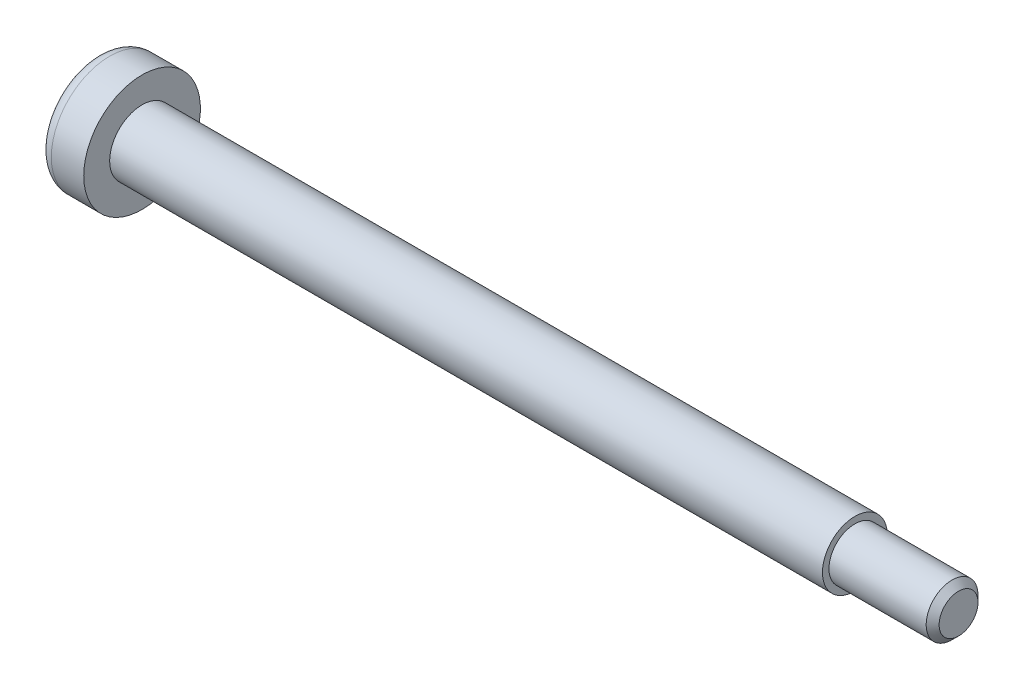
ISO-10303-21;
HEADER;
FILE_DESCRIPTION(('STEP AP214'),'2;1');
FILE_NAME('part.step','',(''),(''),'','','');
FILE_SCHEMA(('AUTOMOTIVE_DESIGN { 1 0 10303 214 1 1 1 1 }'));
ENDSEC;
DATA;
#1=APPLICATION_CONTEXT('core data for automotive mechanical design processes');
#2=APPLICATION_PROTOCOL_DEFINITION('international standard','automotive_design',2000,#1);
#3=PRODUCT_CONTEXT('',#1,'mechanical');
#4=PRODUCT('Part','Part','',(#3));
#5=PRODUCT_RELATED_PRODUCT_CATEGORY('part','',(#4));
#6=PRODUCT_DEFINITION_FORMATION('','',#4);
#7=PRODUCT_DEFINITION_CONTEXT('part definition',#1,'design');
#8=PRODUCT_DEFINITION('design','',#6,#7);
#9=PRODUCT_DEFINITION_SHAPE('','',#8);
#10=(LENGTH_UNIT() NAMED_UNIT(*) SI_UNIT(.MILLI.,.METRE.));
#11=(NAMED_UNIT(*) PLANE_ANGLE_UNIT() SI_UNIT($,.RADIAN.));
#12=(NAMED_UNIT(*) SI_UNIT($,.STERADIAN.) SOLID_ANGLE_UNIT());
#13=UNCERTAINTY_MEASURE_WITH_UNIT(LENGTH_MEASURE(1.E-05),#10,'distance_accuracy_value','');
#14=(GEOMETRIC_REPRESENTATION_CONTEXT(3) GLOBAL_UNCERTAINTY_ASSIGNED_CONTEXT((#13)) GLOBAL_UNIT_ASSIGNED_CONTEXT((#10,
#11,#12)) REPRESENTATION_CONTEXT('',''));
#15=CARTESIAN_POINT('',(0.,0.,0.));
#16=DIRECTION('',(0.,0.,1.));
#17=DIRECTION('',(1.,0.,0.));
#18=AXIS2_PLACEMENT_3D('',#15,#16,#17);
#19=CARTESIAN_POINT('',(0.,0.,0.));
#20=DIRECTION('',(1.,0.,0.));
#21=DIRECTION('',(0.,0.,-1.));
#22=AXIS2_PLACEMENT_3D('',#19,#20,#21);
#23=PLANE('',#22);
#24=CARTESIAN_POINT('',(0.,0.,0.));
#25=DIRECTION('',(1.,0.,0.));
#26=DIRECTION('',(0.,0.,-1.));
#27=AXIS2_PLACEMENT_3D('',#24,#25,#26);
#28=CIRCLE('',#27,3.5);
#29=CARTESIAN_POINT('',(0.,0.,-3.5));
#30=VERTEX_POINT('',#29);
#31=EDGE_CURVE('E156',#30,#30,#28,.F.);
#32=ORIENTED_EDGE('',*,*,#31,.T.);
#33=EDGE_LOOP('',(#32));
#34=FACE_BOUND('',#33,.T.);
#35=DIRECTION('',(0.,-0.5,-0.866025403784439));
#36=VECTOR('',#35,1.);
#37=CARTESIAN_POINT('',(0.,1.73205080756888,0.));
#38=LINE('',#37,#36);
#39=CARTESIAN_POINT('',(0.,1.73205080756888,0.));
#40=VERTEX_POINT('',#39);
#41=CARTESIAN_POINT('',(0.,0.866025403784439,-1.5));
#42=VERTEX_POINT('',#41);
#43=EDGE_CURVE('E126',#40,#42,#38,.T.);
#44=ORIENTED_EDGE('',*,*,#43,.F.);
#45=DIRECTION('',(0.,0.5,-0.866025403784439));
#46=VECTOR('',#45,1.);
#47=CARTESIAN_POINT('',(0.,0.86602540378444,1.5));
#48=LINE('',#47,#46);
#49=CARTESIAN_POINT('',(0.,0.86602540378444,1.5));
#50=VERTEX_POINT('',#49);
#51=EDGE_CURVE('E52',#50,#40,#48,.T.);
#52=ORIENTED_EDGE('',*,*,#51,.F.);
#53=DIRECTION('',(0.,1.,0.));
#54=VECTOR('',#53,1.);
#55=CARTESIAN_POINT('',(0.,-0.866025403784439,1.5));
#56=LINE('',#55,#54);
#57=CARTESIAN_POINT('',(0.,-0.866025403784439,1.5));
#58=VERTEX_POINT('',#57);
#59=EDGE_CURVE('E135',#58,#50,#56,.T.);
#60=ORIENTED_EDGE('',*,*,#59,.F.);
#61=DIRECTION('',(0.,0.5,0.866025403784439));
#62=VECTOR('',#61,1.);
#63=CARTESIAN_POINT('',(0.,-1.73205080756888,0.));
#64=LINE('',#63,#62);
#65=CARTESIAN_POINT('',(0.,-1.73205080756888,0.));
#66=VERTEX_POINT('',#65);
#67=EDGE_CURVE('E133',#66,#58,#64,.T.);
#68=ORIENTED_EDGE('',*,*,#67,.F.);
#69=DIRECTION('',(0.,-0.5,0.866025403784439));
#70=VECTOR('',#69,1.);
#71=CARTESIAN_POINT('',(0.,-0.866025403784439,-1.5));
#72=LINE('',#71,#70);
#73=CARTESIAN_POINT('',(0.,-0.866025403784439,-1.5));
#74=VERTEX_POINT('',#73);
#75=EDGE_CURVE('E100',#74,#66,#72,.T.);
#76=ORIENTED_EDGE('',*,*,#75,.F.);
#77=DIRECTION('',(0.,-1.,0.));
#78=VECTOR('',#77,1.);
#79=CARTESIAN_POINT('',(0.,0.866025403784439,-1.5));
#80=LINE('',#79,#78);
#81=EDGE_CURVE('E129',#42,#74,#80,.T.);
#82=ORIENTED_EDGE('',*,*,#81,.F.);
#83=EDGE_LOOP('',(#44,#52,#60,#68,#76,#82));
#84=FACE_BOUND('',#83,.T.);
#85=ADVANCED_FACE('F37',(#34,#84),#23,.F.);
#86=CARTESIAN_POINT('',(0.,0.,0.));
#87=DIRECTION('',(-1.,0.,0.));
#88=DIRECTION('',(0.,0.,1.));
#89=AXIS2_PLACEMENT_3D('',#86,#87,#88);
#90=CYLINDRICAL_SURFACE('',#89,4.5);
#91=CARTESIAN_POINT('',(1.,0.,0.));
#92=DIRECTION('',(1.,0.,0.));
#93=DIRECTION('',(0.,0.,-1.));
#94=AXIS2_PLACEMENT_3D('',#91,#92,#93);
#95=CIRCLE('',#94,4.5);
#96=CARTESIAN_POINT('',(1.,0.,-4.5));
#97=VERTEX_POINT('',#96);
#98=EDGE_CURVE('E159',#97,#97,#95,.T.);
#99=ORIENTED_EDGE('',*,*,#98,.T.);
#100=EDGE_LOOP('',(#99));
#101=FACE_BOUND('',#100,.T.);
#102=CARTESIAN_POINT('',(3.5,0.,0.));
#103=DIRECTION('',(-1.,0.,0.));
#104=DIRECTION('',(0.,0.,1.));
#105=AXIS2_PLACEMENT_3D('',#102,#103,#104);
#106=CIRCLE('',#105,4.5);
#107=CARTESIAN_POINT('',(3.5,0.,4.5));
#108=VERTEX_POINT('',#107);
#109=EDGE_CURVE('E153',#108,#108,#106,.T.);
#110=ORIENTED_EDGE('',*,*,#109,.T.);
#111=EDGE_LOOP('',(#110));
#112=FACE_BOUND('',#111,.T.);
#113=ADVANCED_FACE('F176',(#101,#112),#90,.T.);
#114=CARTESIAN_POINT('',(3.5,4.5,0.));
#115=DIRECTION('',(-1.,0.,0.));
#116=DIRECTION('',(0.,0.,1.));
#117=AXIS2_PLACEMENT_3D('',#114,#115,#116);
#118=PLANE('',#117);
#119=ORIENTED_EDGE('',*,*,#109,.F.);
#120=EDGE_LOOP('',(#119));
#121=FACE_BOUND('',#120,.T.);
#122=CARTESIAN_POINT('',(3.5,0.,0.));
#123=DIRECTION('',(-1.,0.,0.));
#124=DIRECTION('',(0.,0.,1.));
#125=AXIS2_PLACEMENT_3D('',#122,#123,#124);
#126=CIRCLE('',#125,2.5);
#127=CARTESIAN_POINT('',(3.5,0.,2.5));
#128=VERTEX_POINT('',#127);
#129=EDGE_CURVE('E150',#128,#128,#126,.T.);
#130=ORIENTED_EDGE('',*,*,#129,.T.);
#131=EDGE_LOOP('',(#130));
#132=FACE_BOUND('',#131,.T.);
#133=ADVANCED_FACE('F182',(#121,#132),#118,.F.);
#134=CARTESIAN_POINT('',(0.,0.,0.));
#135=DIRECTION('',(-1.,0.,0.));
#136=DIRECTION('',(0.,0.,1.));
#137=AXIS2_PLACEMENT_3D('',#134,#135,#136);
#138=CYLINDRICAL_SURFACE('',#137,2.5);
#139=ORIENTED_EDGE('',*,*,#129,.F.);
#140=EDGE_LOOP('',(#139));
#141=FACE_BOUND('',#140,.T.);
#142=CARTESIAN_POINT('',(58.5,0.,0.));
#143=DIRECTION('',(-1.,0.,0.));
#144=DIRECTION('',(0.,0.,1.));
#145=AXIS2_PLACEMENT_3D('',#142,#143,#144);
#146=CIRCLE('',#145,2.5);
#147=CARTESIAN_POINT('',(58.5,0.,2.5));
#148=VERTEX_POINT('',#147);
#149=EDGE_CURVE('E147',#148,#148,#146,.T.);
#150=ORIENTED_EDGE('',*,*,#149,.T.);
#151=EDGE_LOOP('',(#150));
#152=FACE_BOUND('',#151,.T.);
#153=ADVANCED_FACE('F189',(#141,#152),#138,.T.);
#154=CARTESIAN_POINT('',(58.5,2.5,0.));
#155=DIRECTION('',(-1.,0.,0.));
#156=DIRECTION('',(0.,0.,1.));
#157=AXIS2_PLACEMENT_3D('',#154,#155,#156);
#158=PLANE('',#157);
#159=ORIENTED_EDGE('',*,*,#149,.F.);
#160=EDGE_LOOP('',(#159));
#161=FACE_BOUND('',#160,.T.);
#162=CARTESIAN_POINT('',(58.5,0.,0.));
#163=DIRECTION('',(-1.,0.,0.));
#164=DIRECTION('',(0.,0.,1.));
#165=AXIS2_PLACEMENT_3D('',#162,#163,#164);
#166=CIRCLE('',#165,2.);
#167=CARTESIAN_POINT('',(58.5,0.,2.));
#168=VERTEX_POINT('',#167);
#169=EDGE_CURVE('E139',#168,#168,#166,.T.);
#170=ORIENTED_EDGE('',*,*,#169,.T.);
#171=EDGE_LOOP('',(#170));
#172=FACE_BOUND('',#171,.T.);
#173=ADVANCED_FACE('F193',(#161,#172),#158,.F.);
#174=CARTESIAN_POINT('',(0.,0.,0.));
#175=DIRECTION('',(-1.,0.,0.));
#176=DIRECTION('',(0.,0.,1.));
#177=AXIS2_PLACEMENT_3D('',#174,#175,#176);
#178=CYLINDRICAL_SURFACE('',#177,2.);
#179=CARTESIAN_POINT('',(66.,0.,0.));
#180=DIRECTION('',(-1.,0.,0.));
#181=DIRECTION('',(0.,0.,1.));
#182=AXIS2_PLACEMENT_3D('',#179,#180,#181);
#183=CIRCLE('',#182,2.);
#184=CARTESIAN_POINT('',(66.,0.,2.));
#185=VERTEX_POINT('',#184);
#186=EDGE_CURVE('E45',#185,#185,#183,.T.);
#187=ORIENTED_EDGE('',*,*,#186,.T.);
#188=EDGE_LOOP('',(#187));
#189=FACE_BOUND('',#188,.T.);
#190=ORIENTED_EDGE('',*,*,#169,.F.);
#191=EDGE_LOOP('',(#190));
#192=FACE_BOUND('',#191,.T.);
#193=ADVANCED_FACE('F164',(#189,#192),#178,.T.);
#194=CARTESIAN_POINT('',(66.5,2.,0.));
#195=DIRECTION('',(-1.,0.,0.));
#196=DIRECTION('',(0.,0.,1.));
#197=AXIS2_PLACEMENT_3D('',#194,#195,#196);
#198=PLANE('',#197);
#199=CARTESIAN_POINT('',(66.5,0.,0.));
#200=DIRECTION('',(-1.,0.,0.));
#201=DIRECTION('',(0.,0.,1.));
#202=AXIS2_PLACEMENT_3D('',#199,#200,#201);
#203=CIRCLE('',#202,1.50000000000001);
#204=CARTESIAN_POINT('',(66.5,0.,1.50000000000001));
#205=VERTEX_POINT('',#204);
#206=EDGE_CURVE('E11',#205,#205,#203,.F.);
#207=ORIENTED_EDGE('',*,*,#206,.T.);
#208=EDGE_LOOP('',(#207));
#209=FACE_BOUND('',#208,.T.);
#210=ADVANCED_FACE('F200',(#209),#198,.F.);
#211=CARTESIAN_POINT('',(2.4,0.86602540378444,1.5));
#212=DIRECTION('',(0.,0.866025403784439,0.5));
#213=DIRECTION('',(0.,-0.5,0.866025403784439));
#214=AXIS2_PLACEMENT_3D('',#211,#212,#213);
#215=PLANE('',#214);
#216=ORIENTED_EDGE('',*,*,#51,.T.);
#217=DIRECTION('',(-1.,0.,0.));
#218=VECTOR('',#217,1.);
#219=CARTESIAN_POINT('',(2.4,1.73205080756888,0.));
#220=LINE('',#219,#218);
#221=CARTESIAN_POINT('',(2.4,1.73205080756888,0.));
#222=VERTEX_POINT('',#221);
#223=EDGE_CURVE('E82',#222,#40,#220,.T.);
#224=ORIENTED_EDGE('',*,*,#223,.F.);
#225=DIRECTION('',(0.,0.5,-0.866025403784439));
#226=VECTOR('',#225,1.);
#227=CARTESIAN_POINT('',(2.4,0.86602540378444,1.5));
#228=LINE('',#227,#226);
#229=CARTESIAN_POINT('',(2.4,0.86602540378444,1.5));
#230=VERTEX_POINT('',#229);
#231=EDGE_CURVE('E137',#230,#222,#228,.T.);
#232=ORIENTED_EDGE('',*,*,#231,.F.);
#233=DIRECTION('',(-1.,0.,0.));
#234=VECTOR('',#233,1.);
#235=CARTESIAN_POINT('',(2.4,0.86602540378444,1.5));
#236=LINE('',#235,#234);
#237=EDGE_CURVE('E60',#230,#50,#236,.T.);
#238=ORIENTED_EDGE('',*,*,#237,.T.);
#239=EDGE_LOOP('',(#216,#224,#232,#238));
#240=FACE_BOUND('',#239,.T.);
#241=ADVANCED_FACE('F203',(#240),#215,.F.);
#242=CARTESIAN_POINT('',(2.4,-0.866025403784439,1.5));
#243=DIRECTION('',(0.,0.,1.));
#244=DIRECTION('',(1.,0.,0.));
#245=AXIS2_PLACEMENT_3D('',#242,#243,#244);
#246=PLANE('',#245);
#247=ORIENTED_EDGE('',*,*,#59,.T.);
#248=ORIENTED_EDGE('',*,*,#237,.F.);
#249=DIRECTION('',(0.,1.,0.));
#250=VECTOR('',#249,1.);
#251=CARTESIAN_POINT('',(2.4,-0.866025403784439,1.5));
#252=LINE('',#251,#250);
#253=CARTESIAN_POINT('',(2.4,-0.866025403784439,1.5));
#254=VERTEX_POINT('',#253);
#255=EDGE_CURVE('E112',#254,#230,#252,.T.);
#256=ORIENTED_EDGE('',*,*,#255,.F.);
#257=DIRECTION('',(-1.,0.,0.));
#258=VECTOR('',#257,1.);
#259=CARTESIAN_POINT('',(2.4,-0.866025403784439,1.5));
#260=LINE('',#259,#258);
#261=EDGE_CURVE('E104',#254,#58,#260,.T.);
#262=ORIENTED_EDGE('',*,*,#261,.T.);
#263=EDGE_LOOP('',(#247,#248,#256,#262));
#264=FACE_BOUND('',#263,.T.);
#265=ADVANCED_FACE('F207',(#264),#246,.F.);
#266=CARTESIAN_POINT('',(2.4,-1.73205080756888,0.));
#267=DIRECTION('',(0.,-0.866025403784439,0.5));
#268=DIRECTION('',(0.,-0.5,-0.866025403784439));
#269=AXIS2_PLACEMENT_3D('',#266,#267,#268);
#270=PLANE('',#269);
#271=ORIENTED_EDGE('',*,*,#67,.T.);
#272=ORIENTED_EDGE('',*,*,#261,.F.);
#273=DIRECTION('',(0.,0.5,0.866025403784439));
#274=VECTOR('',#273,1.);
#275=CARTESIAN_POINT('',(2.4,-1.73205080756888,0.));
#276=LINE('',#275,#274);
#277=CARTESIAN_POINT('',(2.4,-1.73205080756888,0.));
#278=VERTEX_POINT('',#277);
#279=EDGE_CURVE('E108',#278,#254,#276,.T.);
#280=ORIENTED_EDGE('',*,*,#279,.F.);
#281=DIRECTION('',(-1.,0.,0.));
#282=VECTOR('',#281,1.);
#283=CARTESIAN_POINT('',(2.4,-1.73205080756888,0.));
#284=LINE('',#283,#282);
#285=EDGE_CURVE('E93',#278,#66,#284,.T.);
#286=ORIENTED_EDGE('',*,*,#285,.T.);
#287=EDGE_LOOP('',(#271,#272,#280,#286));
#288=FACE_BOUND('',#287,.T.);
#289=ADVANCED_FACE('F109',(#288),#270,.F.);
#290=CARTESIAN_POINT('',(2.4,-0.866025403784439,-1.5));
#291=DIRECTION('',(0.,-0.866025403784439,-0.5));
#292=DIRECTION('',(0.,0.5,-0.866025403784439));
#293=AXIS2_PLACEMENT_3D('',#290,#291,#292);
#294=PLANE('',#293);
#295=ORIENTED_EDGE('',*,*,#75,.T.);
#296=ORIENTED_EDGE('',*,*,#285,.F.);
#297=DIRECTION('',(0.,-0.5,0.866025403784439));
#298=VECTOR('',#297,1.);
#299=CARTESIAN_POINT('',(2.4,-0.866025403784439,-1.5));
#300=LINE('',#299,#298);
#301=CARTESIAN_POINT('',(2.4,-0.866025403784439,-1.5));
#302=VERTEX_POINT('',#301);
#303=EDGE_CURVE('E97',#302,#278,#300,.T.);
#304=ORIENTED_EDGE('',*,*,#303,.F.);
#305=DIRECTION('',(-1.,0.,0.));
#306=VECTOR('',#305,1.);
#307=CARTESIAN_POINT('',(2.4,-0.866025403784439,-1.5));
#308=LINE('',#307,#306);
#309=EDGE_CURVE('E105',#302,#74,#308,.T.);
#310=ORIENTED_EDGE('',*,*,#309,.T.);
#311=EDGE_LOOP('',(#295,#296,#304,#310));
#312=FACE_BOUND('',#311,.T.);
#313=ADVANCED_FACE('F95',(#312),#294,.F.);
#314=CARTESIAN_POINT('',(2.4,0.866025403784439,-1.5));
#315=DIRECTION('',(0.,0.,-1.));
#316=DIRECTION('',(-1.,0.,0.));
#317=AXIS2_PLACEMENT_3D('',#314,#315,#316);
#318=PLANE('',#317);
#319=ORIENTED_EDGE('',*,*,#81,.T.);
#320=ORIENTED_EDGE('',*,*,#309,.F.);
#321=DIRECTION('',(0.,-1.,0.));
#322=VECTOR('',#321,1.);
#323=CARTESIAN_POINT('',(2.4,0.866025403784439,-1.5));
#324=LINE('',#323,#322);
#325=CARTESIAN_POINT('',(2.4,0.866025403784439,-1.5));
#326=VERTEX_POINT('',#325);
#327=EDGE_CURVE('E118',#326,#302,#324,.T.);
#328=ORIENTED_EDGE('',*,*,#327,.F.);
#329=DIRECTION('',(-1.,0.,0.));
#330=VECTOR('',#329,1.);
#331=CARTESIAN_POINT('',(2.4,0.866025403784439,-1.5));
#332=LINE('',#331,#330);
#333=EDGE_CURVE('E142',#326,#42,#332,.T.);
#334=ORIENTED_EDGE('',*,*,#333,.T.);
#335=EDGE_LOOP('',(#319,#320,#328,#334));
#336=FACE_BOUND('',#335,.T.);
#337=ADVANCED_FACE('F211',(#336),#318,.F.);
#338=CARTESIAN_POINT('',(2.4,1.73205080756888,0.));
#339=DIRECTION('',(0.,0.866025403784439,-0.5));
#340=DIRECTION('',(0.,0.5,0.866025403784439));
#341=AXIS2_PLACEMENT_3D('',#338,#339,#340);
#342=PLANE('',#341);
#343=ORIENTED_EDGE('',*,*,#43,.T.);
#344=ORIENTED_EDGE('',*,*,#333,.F.);
#345=DIRECTION('',(0.,-0.5,-0.866025403784439));
#346=VECTOR('',#345,1.);
#347=CARTESIAN_POINT('',(2.4,1.73205080756888,0.));
#348=LINE('',#347,#346);
#349=EDGE_CURVE('E120',#222,#326,#348,.T.);
#350=ORIENTED_EDGE('',*,*,#349,.F.);
#351=ORIENTED_EDGE('',*,*,#223,.T.);
#352=EDGE_LOOP('',(#343,#344,#350,#351));
#353=FACE_BOUND('',#352,.T.);
#354=ADVANCED_FACE('F208',(#353),#342,.F.);
#355=CARTESIAN_POINT('',(2.4,0.,0.));
#356=DIRECTION('',(-1.,0.,0.));
#357=DIRECTION('',(0.,0.,1.));
#358=AXIS2_PLACEMENT_3D('',#355,#356,#357);
#359=PLANE('',#358);
#360=ORIENTED_EDGE('',*,*,#231,.T.);
#361=ORIENTED_EDGE('',*,*,#349,.T.);
#362=ORIENTED_EDGE('',*,*,#327,.T.);
#363=ORIENTED_EDGE('',*,*,#303,.T.);
#364=ORIENTED_EDGE('',*,*,#279,.T.);
#365=ORIENTED_EDGE('',*,*,#255,.T.);
#366=EDGE_LOOP('',(#360,#361,#362,#363,#364,#365));
#367=FACE_BOUND('',#366,.T.);
#368=ADVANCED_FACE('F115',(#367),#359,.T.);
#369=CARTESIAN_POINT('',(1.,0.,0.));
#370=DIRECTION('',(1.,0.,0.));
#371=DIRECTION('',(0.,0.,-1.));
#372=AXIS2_PLACEMENT_3D('',#369,#370,#371);
#373=TOROIDAL_SURFACE('',#372,3.5,1.);
#374=ORIENTED_EDGE('',*,*,#98,.F.);
#375=EDGE_LOOP('',(#374));
#376=FACE_BOUND('',#375,.T.);
#377=ORIENTED_EDGE('',*,*,#31,.F.);
#378=EDGE_LOOP('',(#377));
#379=FACE_BOUND('',#378,.T.);
#380=ADVANCED_FACE('F168',(#376,#379),#373,.T.);
#381=CARTESIAN_POINT('',(66.,0.,0.));
#382=DIRECTION('',(-1.,0.,0.));
#383=DIRECTION('',(0.,0.,1.));
#384=AXIS2_PLACEMENT_3D('',#381,#382,#383);
#385=CONICAL_SURFACE('',#384,2.,0.785398163397454);
#386=ORIENTED_EDGE('',*,*,#206,.F.);
#387=EDGE_LOOP('',(#386));
#388=FACE_BOUND('',#387,.T.);
#389=ORIENTED_EDGE('',*,*,#186,.F.);
#390=EDGE_LOOP('',(#389));
#391=FACE_BOUND('',#390,.T.);
#392=ADVANCED_FACE('F39',(#388,#391),#385,.T.);
#393=CLOSED_SHELL('',(#85,#113,#133,#153,#173,#193,#210,#241,#265,#289,#313,#337,#354,#368,#380,#392));
#394=MANIFOLD_SOLID_BREP('B2',#393);
#395=ADVANCED_BREP_SHAPE_REPRESENTATION('',(#18,#394),#14);
#396=SHAPE_DEFINITION_REPRESENTATION(#9,#395);
ENDSEC;
END-ISO-10303-21;
